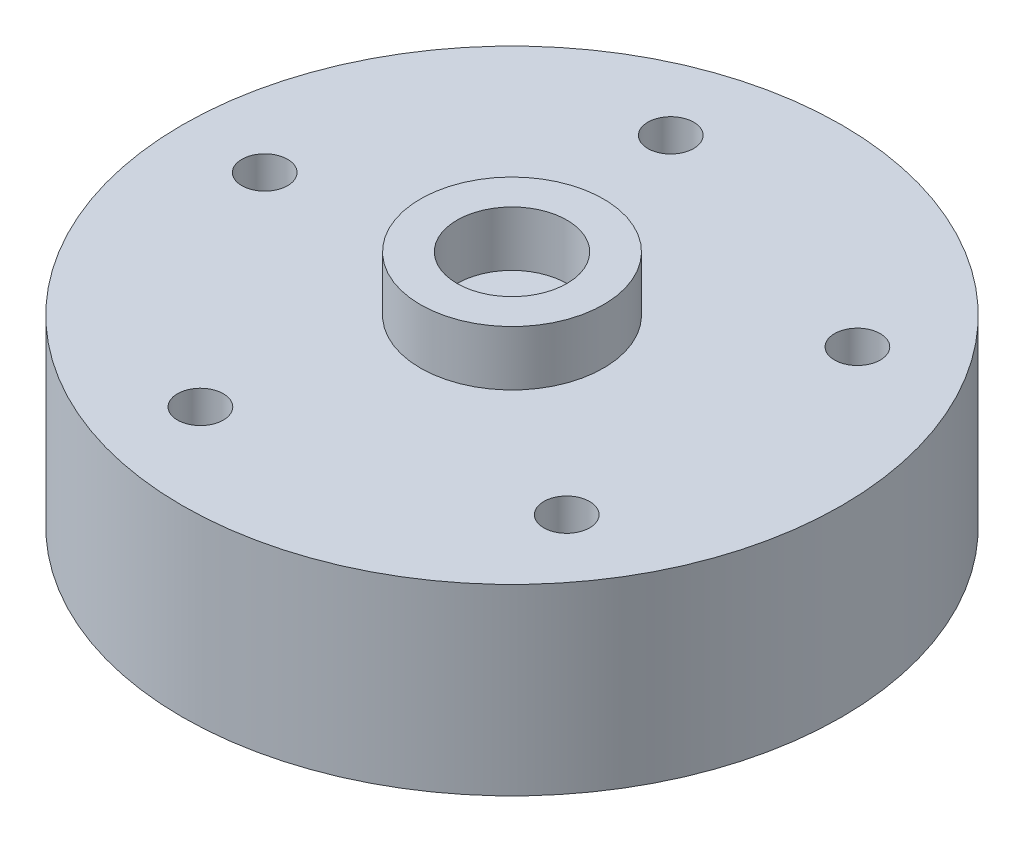
ISO-10303-21;
HEADER;
FILE_DESCRIPTION(('STEP AP214'),'2;1');
FILE_NAME('part.step','',(''),(''),'','','');
FILE_SCHEMA(('AUTOMOTIVE_DESIGN { 1 0 10303 214 1 1 1 1 }'));
ENDSEC;
DATA;
#1=APPLICATION_CONTEXT('core data for automotive mechanical design processes');
#2=APPLICATION_PROTOCOL_DEFINITION('international standard','automotive_design',2000,#1);
#3=PRODUCT_CONTEXT('',#1,'mechanical');
#4=PRODUCT('Part','Part','',(#3));
#5=PRODUCT_RELATED_PRODUCT_CATEGORY('part','',(#4));
#6=PRODUCT_DEFINITION_FORMATION('','',#4);
#7=PRODUCT_DEFINITION_CONTEXT('part definition',#1,'design');
#8=PRODUCT_DEFINITION('design','',#6,#7);
#9=PRODUCT_DEFINITION_SHAPE('','',#8);
#10=(LENGTH_UNIT() NAMED_UNIT(*) SI_UNIT(.MILLI.,.METRE.));
#11=(NAMED_UNIT(*) PLANE_ANGLE_UNIT() SI_UNIT($,.RADIAN.));
#12=(NAMED_UNIT(*) SI_UNIT($,.STERADIAN.) SOLID_ANGLE_UNIT());
#13=UNCERTAINTY_MEASURE_WITH_UNIT(LENGTH_MEASURE(1.E-05),#10,'distance_accuracy_value','');
#14=(GEOMETRIC_REPRESENTATION_CONTEXT(3) GLOBAL_UNCERTAINTY_ASSIGNED_CONTEXT((#13)) GLOBAL_UNIT_ASSIGNED_CONTEXT((#10,
#11,#12)) REPRESENTATION_CONTEXT('',''));
#15=CARTESIAN_POINT('',(0.,0.,0.));
#16=DIRECTION('',(0.,0.,1.));
#17=DIRECTION('',(1.,0.,0.));
#18=AXIS2_PLACEMENT_3D('',#15,#16,#17);
#19=CARTESIAN_POINT('',(0.,1.,0.));
#20=DIRECTION('',(0.,-1.,0.));
#21=DIRECTION('',(0.,0.,-1.));
#22=AXIS2_PLACEMENT_3D('',#19,#20,#21);
#23=CYLINDRICAL_SURFACE('',#22,2.);
#24=CARTESIAN_POINT('',(0.,1.,0.));
#25=DIRECTION('',(0.,-1.,0.));
#26=DIRECTION('',(0.,0.,-1.));
#27=AXIS2_PLACEMENT_3D('',#24,#25,#26);
#28=CIRCLE('',#27,2.);
#29=CARTESIAN_POINT('',(0.,1.,-2.));
#30=VERTEX_POINT('',#29);
#31=EDGE_CURVE('E52',#30,#30,#28,.T.);
#32=ORIENTED_EDGE('',*,*,#31,.F.);
#33=EDGE_LOOP('',(#32));
#34=FACE_BOUND('',#33,.T.);
#35=CARTESIAN_POINT('',(0.,-1.,0.));
#36=DIRECTION('',(0.,-1.,0.));
#37=DIRECTION('',(0.,0.,-1.));
#38=AXIS2_PLACEMENT_3D('',#35,#36,#37);
#39=CIRCLE('',#38,2.);
#40=CARTESIAN_POINT('',(0.,-1.,-2.));
#41=VERTEX_POINT('',#40);
#42=EDGE_CURVE('E37',#41,#41,#39,.F.);
#43=ORIENTED_EDGE('',*,*,#42,.F.);
#44=EDGE_LOOP('',(#43));
#45=FACE_BOUND('',#44,.T.);
#46=ADVANCED_FACE('F33',(#34,#45),#23,.F.);
#47=CARTESIAN_POINT('',(0.,-3.,0.));
#48=DIRECTION('',(0.,1.,0.));
#49=DIRECTION('',(0.,0.,1.));
#50=AXIS2_PLACEMENT_3D('',#47,#48,#49);
#51=CYLINDRICAL_SURFACE('',#50,1.25);
#52=CARTESIAN_POINT('',(0.,2.,0.));
#53=DIRECTION('',(0.,1.,0.));
#54=DIRECTION('',(0.,0.,1.));
#55=AXIS2_PLACEMENT_3D('',#52,#53,#54);
#56=CIRCLE('',#55,1.25);
#57=CARTESIAN_POINT('',(0.,2.,1.25));
#58=VERTEX_POINT('',#57);
#59=EDGE_CURVE('E98',#58,#58,#56,.T.);
#60=ORIENTED_EDGE('',*,*,#59,.T.);
#61=EDGE_LOOP('',(#60));
#62=FACE_BOUND('',#61,.T.);
#63=CARTESIAN_POINT('',(0.,1.,0.));
#64=DIRECTION('',(0.,-1.,0.));
#65=DIRECTION('',(0.,0.,-1.));
#66=AXIS2_PLACEMENT_3D('',#63,#64,#65);
#67=CIRCLE('',#66,1.25);
#68=CARTESIAN_POINT('',(0.,1.,-1.25));
#69=VERTEX_POINT('',#68);
#70=EDGE_CURVE('E49',#69,#69,#67,.F.);
#71=ORIENTED_EDGE('',*,*,#70,.F.);
#72=EDGE_LOOP('',(#71));
#73=FACE_BOUND('',#72,.T.);
#74=ADVANCED_FACE('F35',(#62,#73),#51,.F.);
#75=CARTESIAN_POINT('',(0.,2.,0.));
#76=DIRECTION('',(0.,1.,0.));
#77=DIRECTION('',(0.,0.,1.));
#78=AXIS2_PLACEMENT_3D('',#75,#76,#77);
#79=PLANE('',#78);
#80=ORIENTED_EDGE('',*,*,#59,.F.);
#81=EDGE_LOOP('',(#80));
#82=FACE_BOUND('',#81,.T.);
#83=CARTESIAN_POINT('',(0.,2.,0.));
#84=DIRECTION('',(0.,1.,0.));
#85=DIRECTION('',(0.,0.,1.));
#86=AXIS2_PLACEMENT_3D('',#83,#84,#85);
#87=CIRCLE('',#86,3.);
#88=CARTESIAN_POINT('',(0.,2.,3.));
#89=VERTEX_POINT('',#88);
#90=EDGE_CURVE('E10',#89,#89,#87,.F.);
#91=ORIENTED_EDGE('',*,*,#90,.F.);
#92=EDGE_LOOP('',(#91));
#93=FACE_BOUND('',#92,.T.);
#94=ADVANCED_FACE('F124',(#82,#93),#79,.T.);
#95=CARTESIAN_POINT('',(10.9217294240618,-3.,7.93510090594839));
#96=DIRECTION('',(0.,1.,0.));
#97=DIRECTION('',(0.,0.,1.));
#98=AXIS2_PLACEMENT_3D('',#95,#96,#97);
#99=CYLINDRICAL_SURFACE('',#98,1.25);
#100=CARTESIAN_POINT('',(10.9217294240618,2.,7.93510090594839));
#101=DIRECTION('',(0.,1.,0.));
#102=DIRECTION('',(0.,0.,1.));
#103=AXIS2_PLACEMENT_3D('',#100,#101,#102);
#104=CIRCLE('',#103,1.25);
#105=CARTESIAN_POINT('',(10.9217294240618,2.,9.18510090594839));
#106=VERTEX_POINT('',#105);
#107=EDGE_CURVE('E41',#106,#106,#104,.T.);
#108=ORIENTED_EDGE('',*,*,#107,.T.);
#109=EDGE_LOOP('',(#108));
#110=FACE_BOUND('',#109,.T.);
#111=CARTESIAN_POINT('',(10.9217294240617,-8.,7.93510090594873));
#112=DIRECTION('',(0.,-1.,0.));
#113=DIRECTION('',(0.,0.,-1.));
#114=AXIS2_PLACEMENT_3D('',#111,#112,#113);
#115=CIRCLE('',#114,1.25);
#116=CARTESIAN_POINT('',(10.9217294240617,-8.,6.68510090594873));
#117=VERTEX_POINT('',#116);
#118=EDGE_CURVE('E76',#117,#117,#115,.T.);
#119=ORIENTED_EDGE('',*,*,#118,.T.);
#120=EDGE_LOOP('',(#119));
#121=FACE_BOUND('',#120,.T.);
#122=ADVANCED_FACE('F182',(#110,#121),#99,.F.);
#123=CARTESIAN_POINT('',(10.9217294240618,-3.,-7.93510090594839));
#124=DIRECTION('',(0.,1.,0.));
#125=DIRECTION('',(0.,0.,1.));
#126=AXIS2_PLACEMENT_3D('',#123,#124,#125);
#127=CYLINDRICAL_SURFACE('',#126,1.25);
#128=CARTESIAN_POINT('',(10.9217294240618,2.,-7.93510090594839));
#129=DIRECTION('',(0.,1.,0.));
#130=DIRECTION('',(0.,0.,1.));
#131=AXIS2_PLACEMENT_3D('',#128,#129,#130);
#132=CIRCLE('',#131,1.25);
#133=CARTESIAN_POINT('',(10.9217294240618,2.,-6.68510090594839));
#134=VERTEX_POINT('',#133);
#135=EDGE_CURVE('E46',#134,#134,#132,.T.);
#136=ORIENTED_EDGE('',*,*,#135,.T.);
#137=EDGE_LOOP('',(#136));
#138=FACE_BOUND('',#137,.T.);
#139=CARTESIAN_POINT('',(10.9217294240619,-8.,-7.93510090594805));
#140=DIRECTION('',(0.,-1.,0.));
#141=DIRECTION('',(0.,0.,-1.));
#142=AXIS2_PLACEMENT_3D('',#139,#140,#141);
#143=CIRCLE('',#142,1.25);
#144=CARTESIAN_POINT('',(10.9217294240619,-8.,-9.18510090594805));
#145=VERTEX_POINT('',#144);
#146=EDGE_CURVE('E73',#145,#145,#143,.T.);
#147=ORIENTED_EDGE('',*,*,#146,.T.);
#148=EDGE_LOOP('',(#147));
#149=FACE_BOUND('',#148,.T.);
#150=ADVANCED_FACE('F114',(#138,#149),#127,.F.);
#151=CARTESIAN_POINT('',(-4.17172942406179,-3.,-12.8392629699846));
#152=DIRECTION('',(0.,1.,0.));
#153=DIRECTION('',(0.,0.,1.));
#154=AXIS2_PLACEMENT_3D('',#151,#152,#153);
#155=CYLINDRICAL_SURFACE('',#154,1.25);
#156=CARTESIAN_POINT('',(-4.17172942406179,2.,-12.8392629699846));
#157=DIRECTION('',(0.,1.,0.));
#158=DIRECTION('',(0.,0.,1.));
#159=AXIS2_PLACEMENT_3D('',#156,#157,#158);
#160=CIRCLE('',#159,1.25);
#161=CARTESIAN_POINT('',(-4.17172942406179,2.,-11.5892629699846));
#162=VERTEX_POINT('',#161);
#163=EDGE_CURVE('E109',#162,#162,#160,.T.);
#164=ORIENTED_EDGE('',*,*,#163,.T.);
#165=EDGE_LOOP('',(#164));
#166=FACE_BOUND('',#165,.T.);
#167=CARTESIAN_POINT('',(-4.17172942406161,-8.,-12.8392629699844));
#168=DIRECTION('',(0.,-1.,0.));
#169=DIRECTION('',(0.,0.,-1.));
#170=AXIS2_PLACEMENT_3D('',#167,#168,#169);
#171=CIRCLE('',#170,1.25);
#172=CARTESIAN_POINT('',(-4.17172942406161,-8.,-14.0892629699844));
#173=VERTEX_POINT('',#172);
#174=EDGE_CURVE('E69',#173,#173,#171,.T.);
#175=ORIENTED_EDGE('',*,*,#174,.T.);
#176=EDGE_LOOP('',(#175));
#177=FACE_BOUND('',#176,.T.);
#178=ADVANCED_FACE('F188',(#166,#177),#155,.F.);
#179=CARTESIAN_POINT('',(-13.5,-3.,0.));
#180=DIRECTION('',(0.,1.,0.));
#181=DIRECTION('',(0.,0.,1.));
#182=AXIS2_PLACEMENT_3D('',#179,#180,#181);
#183=CYLINDRICAL_SURFACE('',#182,1.25);
#184=CARTESIAN_POINT('',(-13.5,2.,0.));
#185=DIRECTION('',(0.,1.,0.));
#186=DIRECTION('',(0.,0.,1.));
#187=AXIS2_PLACEMENT_3D('',#184,#185,#186);
#188=CIRCLE('',#187,1.25);
#189=CARTESIAN_POINT('',(-13.5,2.,1.25));
#190=VERTEX_POINT('',#189);
#191=EDGE_CURVE('E106',#190,#190,#188,.T.);
#192=ORIENTED_EDGE('',*,*,#191,.T.);
#193=EDGE_LOOP('',(#192));
#194=FACE_BOUND('',#193,.T.);
#195=CARTESIAN_POINT('',(-13.5,-8.,0.));
#196=DIRECTION('',(0.,-1.,0.));
#197=DIRECTION('',(0.,0.,-1.));
#198=AXIS2_PLACEMENT_3D('',#195,#196,#197);
#199=CIRCLE('',#198,1.25);
#200=CARTESIAN_POINT('',(-13.5,-8.,-1.25));
#201=VERTEX_POINT('',#200);
#202=EDGE_CURVE('E82',#201,#201,#199,.T.);
#203=ORIENTED_EDGE('',*,*,#202,.T.);
#204=EDGE_LOOP('',(#203));
#205=FACE_BOUND('',#204,.T.);
#206=ADVANCED_FACE('F178',(#194,#205),#183,.F.);
#207=CARTESIAN_POINT('',(-4.17172942406179,-3.,12.8392629699846));
#208=DIRECTION('',(0.,1.,0.));
#209=DIRECTION('',(0.,0.,1.));
#210=AXIS2_PLACEMENT_3D('',#207,#208,#209);
#211=CYLINDRICAL_SURFACE('',#210,1.25);
#212=CARTESIAN_POINT('',(-4.17172942406179,2.,12.8392629699846));
#213=DIRECTION('',(0.,1.,0.));
#214=DIRECTION('',(0.,0.,1.));
#215=AXIS2_PLACEMENT_3D('',#212,#213,#214);
#216=CIRCLE('',#215,1.25);
#217=CARTESIAN_POINT('',(-4.17172942406179,2.,14.0892629699846));
#218=VERTEX_POINT('',#217);
#219=EDGE_CURVE('E103',#218,#218,#216,.T.);
#220=ORIENTED_EDGE('',*,*,#219,.T.);
#221=EDGE_LOOP('',(#220));
#222=FACE_BOUND('',#221,.T.);
#223=CARTESIAN_POINT('',(-4.17172942406175,-8.,12.8392629699846));
#224=DIRECTION('',(0.,-1.,0.));
#225=DIRECTION('',(0.,0.,-1.));
#226=AXIS2_PLACEMENT_3D('',#223,#224,#225);
#227=CIRCLE('',#226,1.25);
#228=CARTESIAN_POINT('',(-4.17172942406175,-8.,11.5892629699846));
#229=VERTEX_POINT('',#228);
#230=EDGE_CURVE('E79',#229,#229,#227,.T.);
#231=ORIENTED_EDGE('',*,*,#230,.T.);
#232=EDGE_LOOP('',(#231));
#233=FACE_BOUND('',#232,.T.);
#234=ADVANCED_FACE('F171',(#222,#233),#211,.F.);
#235=CARTESIAN_POINT('',(0.,-3.,0.));
#236=DIRECTION('',(0.,1.,0.));
#237=DIRECTION('',(0.,0.,1.));
#238=AXIS2_PLACEMENT_3D('',#235,#236,#237);
#239=PLANE('',#238);
#240=CARTESIAN_POINT('',(0.,-3.,0.));
#241=DIRECTION('',(0.,-1.,0.));
#242=DIRECTION('',(0.,0.,-1.));
#243=AXIS2_PLACEMENT_3D('',#240,#241,#242);
#244=CIRCLE('',#243,3.75);
#245=CARTESIAN_POINT('',(0.,-3.,-3.75));
#246=VERTEX_POINT('',#245);
#247=EDGE_CURVE('E66',#246,#246,#244,.T.);
#248=ORIENTED_EDGE('',*,*,#247,.F.);
#249=EDGE_LOOP('',(#248));
#250=FACE_BOUND('',#249,.T.);
#251=CARTESIAN_POINT('',(0.,-3.,0.));
#252=DIRECTION('',(0.,-1.,0.));
#253=DIRECTION('',(0.,0.,-1.));
#254=AXIS2_PLACEMENT_3D('',#251,#252,#253);
#255=CIRCLE('',#254,11.);
#256=CARTESIAN_POINT('',(0.,-3.,-11.));
#257=VERTEX_POINT('',#256);
#258=EDGE_CURVE('E85',#257,#257,#255,.T.);
#259=ORIENTED_EDGE('',*,*,#258,.T.);
#260=EDGE_LOOP('',(#259));
#261=FACE_BOUND('',#260,.T.);
#262=ADVANCED_FACE('F121',(#250,#261),#239,.F.);
#263=CARTESIAN_POINT('',(0.,2.,0.));
#264=DIRECTION('',(0.,1.,0.));
#265=DIRECTION('',(0.,0.,1.));
#266=AXIS2_PLACEMENT_3D('',#263,#264,#265);
#267=CIRCLE('',#266,5.);
#268=CARTESIAN_POINT('',(0.,2.,5.));
#269=VERTEX_POINT('',#268);
#270=EDGE_CURVE('E89',#269,#269,#267,.T.);
#271=ORIENTED_EDGE('',*,*,#270,.F.);
#272=EDGE_LOOP('',(#271));
#273=FACE_BOUND('',#272,.T.);
#274=ORIENTED_EDGE('',*,*,#219,.F.);
#275=EDGE_LOOP('',(#274));
#276=FACE_BOUND('',#275,.T.);
#277=ORIENTED_EDGE('',*,*,#191,.F.);
#278=EDGE_LOOP('',(#277));
#279=FACE_BOUND('',#278,.T.);
#280=ORIENTED_EDGE('',*,*,#163,.F.);
#281=EDGE_LOOP('',(#280));
#282=FACE_BOUND('',#281,.T.);
#283=ORIENTED_EDGE('',*,*,#135,.F.);
#284=EDGE_LOOP('',(#283));
#285=FACE_BOUND('',#284,.T.);
#286=ORIENTED_EDGE('',*,*,#107,.F.);
#287=EDGE_LOOP('',(#286));
#288=FACE_BOUND('',#287,.T.);
#289=CARTESIAN_POINT('',(0.,2.,0.));
#290=DIRECTION('',(0.,1.,0.));
#291=DIRECTION('',(0.,0.,1.));
#292=AXIS2_PLACEMENT_3D('',#289,#290,#291);
#293=CIRCLE('',#292,18.);
#294=CARTESIAN_POINT('',(0.,2.,18.));
#295=VERTEX_POINT('',#294);
#296=EDGE_CURVE('E51',#295,#295,#293,.T.);
#297=ORIENTED_EDGE('',*,*,#296,.T.);
#298=EDGE_LOOP('',(#297));
#299=FACE_BOUND('',#298,.T.);
#300=ADVANCED_FACE('F117',(#273,#276,#279,#282,#285,#288,#299),#79,.T.);
#301=CARTESIAN_POINT('',(0.,5.,0.));
#302=DIRECTION('',(0.,-1.,0.));
#303=DIRECTION('',(0.,0.,-1.));
#304=AXIS2_PLACEMENT_3D('',#301,#302,#303);
#305=CYLINDRICAL_SURFACE('',#304,3.);
#306=CARTESIAN_POINT('',(0.,5.,0.));
#307=DIRECTION('',(0.,1.,0.));
#308=DIRECTION('',(0.,0.,1.));
#309=AXIS2_PLACEMENT_3D('',#306,#307,#308);
#310=CIRCLE('',#309,3.);
#311=CARTESIAN_POINT('',(0.,5.,3.));
#312=VERTEX_POINT('',#311);
#313=EDGE_CURVE('E92',#312,#312,#310,.T.);
#314=ORIENTED_EDGE('',*,*,#313,.T.);
#315=EDGE_LOOP('',(#314));
#316=FACE_BOUND('',#315,.T.);
#317=ORIENTED_EDGE('',*,*,#90,.T.);
#318=EDGE_LOOP('',(#317));
#319=FACE_BOUND('',#318,.T.);
#320=ADVANCED_FACE('F120',(#316,#319),#305,.F.);
#321=CARTESIAN_POINT('',(0.,5.,0.));
#322=DIRECTION('',(0.,-1.,0.));
#323=DIRECTION('',(0.,0.,-1.));
#324=AXIS2_PLACEMENT_3D('',#321,#322,#323);
#325=CYLINDRICAL_SURFACE('',#324,5.);
#326=CARTESIAN_POINT('',(0.,5.,0.));
#327=DIRECTION('',(0.,1.,0.));
#328=DIRECTION('',(0.,0.,1.));
#329=AXIS2_PLACEMENT_3D('',#326,#327,#328);
#330=CIRCLE('',#329,5.);
#331=CARTESIAN_POINT('',(0.,5.,5.));
#332=VERTEX_POINT('',#331);
#333=EDGE_CURVE('E95',#332,#332,#330,.T.);
#334=ORIENTED_EDGE('',*,*,#333,.F.);
#335=EDGE_LOOP('',(#334));
#336=FACE_BOUND('',#335,.T.);
#337=ORIENTED_EDGE('',*,*,#270,.T.);
#338=EDGE_LOOP('',(#337));
#339=FACE_BOUND('',#338,.T.);
#340=ADVANCED_FACE('F215',(#336,#339),#325,.T.);
#341=CARTESIAN_POINT('',(0.,5.,0.));
#342=DIRECTION('',(0.,1.,0.));
#343=DIRECTION('',(0.,0.,1.));
#344=AXIS2_PLACEMENT_3D('',#341,#342,#343);
#345=PLANE('',#344);
#346=ORIENTED_EDGE('',*,*,#313,.F.);
#347=EDGE_LOOP('',(#346));
#348=FACE_BOUND('',#347,.T.);
#349=ORIENTED_EDGE('',*,*,#333,.T.);
#350=EDGE_LOOP('',(#349));
#351=FACE_BOUND('',#350,.T.);
#352=ADVANCED_FACE('F202',(#348,#351),#345,.T.);
#353=CARTESIAN_POINT('',(0.,-8.,0.));
#354=DIRECTION('',(0.,-1.,0.));
#355=DIRECTION('',(0.,0.,-1.));
#356=AXIS2_PLACEMENT_3D('',#353,#354,#355);
#357=PLANE('',#356);
#358=ORIENTED_EDGE('',*,*,#146,.F.);
#359=EDGE_LOOP('',(#358));
#360=FACE_BOUND('',#359,.T.);
#361=ORIENTED_EDGE('',*,*,#230,.F.);
#362=EDGE_LOOP('',(#361));
#363=FACE_BOUND('',#362,.T.);
#364=CARTESIAN_POINT('',(0.,-8.,0.));
#365=DIRECTION('',(0.,-1.,0.));
#366=DIRECTION('',(0.,0.,-1.));
#367=AXIS2_PLACEMENT_3D('',#364,#365,#366);
#368=CIRCLE('',#367,11.);
#369=CARTESIAN_POINT('',(0.,-8.,-11.));
#370=VERTEX_POINT('',#369);
#371=EDGE_CURVE('E86',#370,#370,#368,.T.);
#372=ORIENTED_EDGE('',*,*,#371,.F.);
#373=EDGE_LOOP('',(#372));
#374=FACE_BOUND('',#373,.T.);
#375=ORIENTED_EDGE('',*,*,#202,.F.);
#376=EDGE_LOOP('',(#375));
#377=FACE_BOUND('',#376,.T.);
#378=ORIENTED_EDGE('',*,*,#118,.F.);
#379=EDGE_LOOP('',(#378));
#380=FACE_BOUND('',#379,.T.);
#381=ORIENTED_EDGE('',*,*,#174,.F.);
#382=EDGE_LOOP('',(#381));
#383=FACE_BOUND('',#382,.T.);
#384=CARTESIAN_POINT('',(0.,-8.,0.));
#385=DIRECTION('',(0.,1.,0.));
#386=DIRECTION('',(0.,0.,1.));
#387=AXIS2_PLACEMENT_3D('',#384,#385,#386);
#388=CIRCLE('',#387,18.);
#389=CARTESIAN_POINT('',(0.,-8.,18.));
#390=VERTEX_POINT('',#389);
#391=EDGE_CURVE('E56',#390,#390,#388,.T.);
#392=ORIENTED_EDGE('',*,*,#391,.F.);
#393=EDGE_LOOP('',(#392));
#394=FACE_BOUND('',#393,.T.);
#395=ADVANCED_FACE('F141',(#360,#363,#374,#377,#380,#383,#394),#357,.T.);
#396=CARTESIAN_POINT('',(0.,-8.,0.));
#397=DIRECTION('',(0.,1.,0.));
#398=DIRECTION('',(0.,0.,1.));
#399=AXIS2_PLACEMENT_3D('',#396,#397,#398);
#400=CYLINDRICAL_SURFACE('',#399,11.);
#401=ORIENTED_EDGE('',*,*,#371,.T.);
#402=EDGE_LOOP('',(#401));
#403=FACE_BOUND('',#402,.T.);
#404=ORIENTED_EDGE('',*,*,#258,.F.);
#405=EDGE_LOOP('',(#404));
#406=FACE_BOUND('',#405,.T.);
#407=ADVANCED_FACE('F132',(#403,#406),#400,.F.);
#408=CARTESIAN_POINT('',(0.,-8.,0.));
#409=DIRECTION('',(0.,1.,0.));
#410=DIRECTION('',(0.,0.,1.));
#411=AXIS2_PLACEMENT_3D('',#408,#409,#410);
#412=CYLINDRICAL_SURFACE('',#411,18.);
#413=ORIENTED_EDGE('',*,*,#391,.T.);
#414=EDGE_LOOP('',(#413));
#415=FACE_BOUND('',#414,.T.);
#416=ORIENTED_EDGE('',*,*,#296,.F.);
#417=EDGE_LOOP('',(#416));
#418=FACE_BOUND('',#417,.T.);
#419=ADVANCED_FACE('F129',(#415,#418),#412,.T.);
#420=CARTESIAN_POINT('',(0.,1.,0.));
#421=DIRECTION('',(0.,-1.,0.));
#422=DIRECTION('',(0.,0.,-1.));
#423=AXIS2_PLACEMENT_3D('',#420,#421,#422);
#424=PLANE('',#423);
#425=ORIENTED_EDGE('',*,*,#31,.T.);
#426=EDGE_LOOP('',(#425));
#427=FACE_BOUND('',#426,.T.);
#428=ORIENTED_EDGE('',*,*,#70,.T.);
#429=EDGE_LOOP('',(#428));
#430=FACE_BOUND('',#429,.T.);
#431=ADVANCED_FACE('F131',(#427,#430),#424,.T.);
#432=CARTESIAN_POINT('',(0.,-1.,0.));
#433=DIRECTION('',(0.,-1.,0.));
#434=DIRECTION('',(0.,0.,-1.));
#435=AXIS2_PLACEMENT_3D('',#432,#433,#434);
#436=PLANE('',#435);
#437=CARTESIAN_POINT('',(0.,-1.,0.));
#438=DIRECTION('',(0.,-1.,0.));
#439=DIRECTION('',(0.,0.,-1.));
#440=AXIS2_PLACEMENT_3D('',#437,#438,#439);
#441=CIRCLE('',#440,3.75);
#442=CARTESIAN_POINT('',(0.,-1.,-3.75));
#443=VERTEX_POINT('',#442);
#444=EDGE_CURVE('E63',#443,#443,#441,.T.);
#445=ORIENTED_EDGE('',*,*,#444,.T.);
#446=EDGE_LOOP('',(#445));
#447=FACE_BOUND('',#446,.T.);
#448=ORIENTED_EDGE('',*,*,#42,.T.);
#449=EDGE_LOOP('',(#448));
#450=FACE_BOUND('',#449,.T.);
#451=ADVANCED_FACE('F139',(#447,#450),#436,.T.);
#452=CARTESIAN_POINT('',(0.,-1.,0.));
#453=DIRECTION('',(0.,-1.,0.));
#454=DIRECTION('',(0.,0.,-1.));
#455=AXIS2_PLACEMENT_3D('',#452,#453,#454);
#456=CYLINDRICAL_SURFACE('',#455,3.75);
#457=ORIENTED_EDGE('',*,*,#444,.F.);
#458=EDGE_LOOP('',(#457));
#459=FACE_BOUND('',#458,.T.);
#460=ORIENTED_EDGE('',*,*,#247,.T.);
#461=EDGE_LOOP('',(#460));
#462=FACE_BOUND('',#461,.T.);
#463=ADVANCED_FACE('F153',(#459,#462),#456,.F.);
#464=CLOSED_SHELL('',(#46,#74,#94,#122,#150,#178,#206,#234,#262,#300,#320,#340,#352,#395,#407,
#419,#431,#451,#463));
#465=MANIFOLD_SOLID_BREP('B2',#464);
#466=ADVANCED_BREP_SHAPE_REPRESENTATION('',(#18,#465),#14);
#467=SHAPE_DEFINITION_REPRESENTATION(#9,#466);
ENDSEC;
END-ISO-10303-21;
